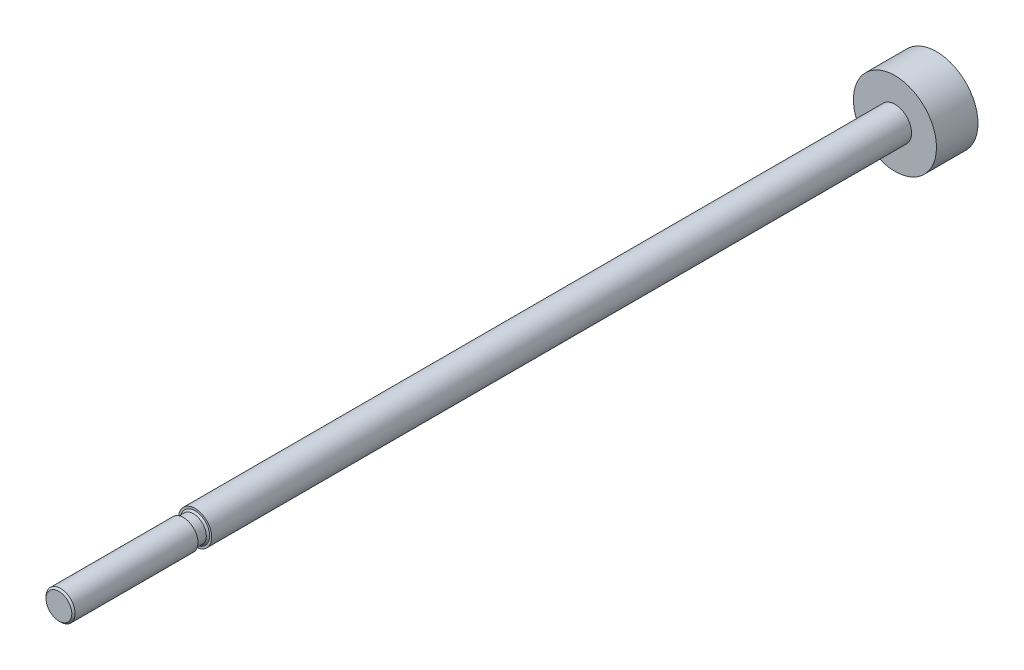
ISO-10303-21;
HEADER;
FILE_DESCRIPTION(('STEP AP214'),'2;1');
FILE_NAME('part.step','',(''),(''),'','','');
FILE_SCHEMA(('AUTOMOTIVE_DESIGN { 1 0 10303 214 1 1 1 1 }'));
ENDSEC;
DATA;
#1=APPLICATION_CONTEXT('core data for automotive mechanical design processes');
#2=APPLICATION_PROTOCOL_DEFINITION('international standard','automotive_design',2000,#1);
#3=PRODUCT_CONTEXT('',#1,'mechanical');
#4=PRODUCT('Part','Part','',(#3));
#5=PRODUCT_RELATED_PRODUCT_CATEGORY('part','',(#4));
#6=PRODUCT_DEFINITION_FORMATION('','',#4);
#7=PRODUCT_DEFINITION_CONTEXT('part definition',#1,'design');
#8=PRODUCT_DEFINITION('design','',#6,#7);
#9=PRODUCT_DEFINITION_SHAPE('','',#8);
#10=(LENGTH_UNIT() NAMED_UNIT(*) SI_UNIT(.MILLI.,.METRE.));
#11=(NAMED_UNIT(*) PLANE_ANGLE_UNIT() SI_UNIT($,.RADIAN.));
#12=(NAMED_UNIT(*) SI_UNIT($,.STERADIAN.) SOLID_ANGLE_UNIT());
#13=UNCERTAINTY_MEASURE_WITH_UNIT(LENGTH_MEASURE(1.E-05),#10,'distance_accuracy_value','');
#14=(GEOMETRIC_REPRESENTATION_CONTEXT(3) GLOBAL_UNCERTAINTY_ASSIGNED_CONTEXT((#13)) GLOBAL_UNIT_ASSIGNED_CONTEXT((#10,
#11,#12)) REPRESENTATION_CONTEXT('',''));
#15=CARTESIAN_POINT('',(0.,0.,0.));
#16=DIRECTION('',(0.,0.,1.));
#17=DIRECTION('',(1.,0.,0.));
#18=AXIS2_PLACEMENT_3D('',#15,#16,#17);
#19=CARTESIAN_POINT('',(0.,0.,2.5));
#20=DIRECTION('',(0.,0.,1.));
#21=DIRECTION('',(1.,0.,0.));
#22=AXIS2_PLACEMENT_3D('',#19,#20,#21);
#23=PLANE('',#22);
#24=CARTESIAN_POINT('',(0.,0.,2.5));
#25=DIRECTION('',(0.,0.,1.));
#26=DIRECTION('',(1.,0.,0.));
#27=AXIS2_PLACEMENT_3D('',#24,#25,#26);
#28=CIRCLE('',#27,5.);
#29=CARTESIAN_POINT('',(5.,0.,2.5));
#30=VERTEX_POINT('',#29);
#31=EDGE_CURVE('E48',#30,#30,#28,.T.);
#32=ORIENTED_EDGE('',*,*,#31,.T.);
#33=EDGE_LOOP('',(#32));
#34=FACE_BOUND('',#33,.T.);
#35=CARTESIAN_POINT('',(0.,0.,2.5));
#36=DIRECTION('',(0.,0.,1.));
#37=DIRECTION('',(1.,0.,0.));
#38=AXIS2_PLACEMENT_3D('',#35,#36,#37);
#39=CIRCLE('',#38,2.);
#40=CARTESIAN_POINT('',(2.,0.,2.5));
#41=VERTEX_POINT('',#40);
#42=EDGE_CURVE('E10',#41,#41,#39,.T.);
#43=ORIENTED_EDGE('',*,*,#42,.F.);
#44=EDGE_LOOP('',(#43));
#45=FACE_BOUND('',#44,.T.);
#46=ADVANCED_FACE('F39',(#34,#45),#23,.T.);
#47=CARTESIAN_POINT('',(0.,0.,2.5));
#48=DIRECTION('',(0.,0.,-1.));
#49=DIRECTION('',(-1.,0.,0.));
#50=AXIS2_PLACEMENT_3D('',#47,#48,#49);
#51=CYLINDRICAL_SURFACE('',#50,5.);
#52=ORIENTED_EDGE('',*,*,#31,.F.);
#53=EDGE_LOOP('',(#52));
#54=FACE_BOUND('',#53,.T.);
#55=CARTESIAN_POINT('',(0.,0.,-2.5));
#56=DIRECTION('',(0.,0.,1.));
#57=DIRECTION('',(1.,0.,0.));
#58=AXIS2_PLACEMENT_3D('',#55,#56,#57);
#59=CIRCLE('',#58,5.);
#60=CARTESIAN_POINT('',(5.,0.,-2.5));
#61=VERTEX_POINT('',#60);
#62=EDGE_CURVE('E53',#61,#61,#59,.T.);
#63=ORIENTED_EDGE('',*,*,#62,.T.);
#64=EDGE_LOOP('',(#63));
#65=FACE_BOUND('',#64,.T.);
#66=ADVANCED_FACE('F124',(#54,#65),#51,.T.);
#67=CARTESIAN_POINT('',(0.,0.,-2.5));
#68=DIRECTION('',(0.,0.,1.));
#69=DIRECTION('',(1.,0.,0.));
#70=AXIS2_PLACEMENT_3D('',#67,#68,#69);
#71=PLANE('',#70);
#72=ORIENTED_EDGE('',*,*,#62,.F.);
#73=EDGE_LOOP('',(#72));
#74=FACE_BOUND('',#73,.T.);
#75=ADVANCED_FACE('F128',(#74),#71,.F.);
#76=CARTESIAN_POINT('',(0.,0.,108.841854249492));
#77=DIRECTION('',(0.,0.,-1.));
#78=DIRECTION('',(-1.,0.,0.));
#79=AXIS2_PLACEMENT_3D('',#76,#77,#78);
#80=CYLINDRICAL_SURFACE('',#79,2.);
#81=CARTESIAN_POINT('',(0.,0.,86.785));
#82=DIRECTION('',(0.,0.,-1.));
#83=DIRECTION('',(-1.,0.,0.));
#84=AXIS2_PLACEMENT_3D('',#81,#82,#83);
#85=CIRCLE('',#84,2.);
#86=CARTESIAN_POINT('',(-2.,0.,86.785));
#87=VERTEX_POINT('',#86);
#88=EDGE_CURVE('E43',#87,#87,#85,.T.);
#89=ORIENTED_EDGE('',*,*,#88,.T.);
#90=EDGE_LOOP('',(#89));
#91=FACE_BOUND('',#90,.T.);
#92=ORIENTED_EDGE('',*,*,#42,.T.);
#93=EDGE_LOOP('',(#92));
#94=FACE_BOUND('',#93,.T.);
#95=ADVANCED_FACE('F41',(#91,#94),#80,.T.);
#96=CARTESIAN_POINT('',(0.,1.74999999999999,86.785));
#97=DIRECTION('',(0.,0.,-1.));
#98=DIRECTION('',(-1.,0.,0.));
#99=AXIS2_PLACEMENT_3D('',#96,#97,#98);
#100=PLANE('',#99);
#101=CARTESIAN_POINT('',(0.,0.,86.785));
#102=DIRECTION('',(0.,0.,-1.));
#103=DIRECTION('',(-1.,0.,0.));
#104=AXIS2_PLACEMENT_3D('',#101,#102,#103);
#105=CIRCLE('',#104,1.74999999999999);
#106=CARTESIAN_POINT('',(-1.74999999999999,0.,86.785));
#107=VERTEX_POINT('',#106);
#108=EDGE_CURVE('E78',#107,#107,#105,.T.);
#109=ORIENTED_EDGE('',*,*,#108,.T.);
#110=EDGE_LOOP('',(#109));
#111=FACE_BOUND('',#110,.T.);
#112=ORIENTED_EDGE('',*,*,#88,.F.);
#113=EDGE_LOOP('',(#112));
#114=FACE_BOUND('',#113,.T.);
#115=ADVANCED_FACE('F82',(#111,#114),#100,.F.);
#116=CARTESIAN_POINT('',(0.,0.,103.185));
#117=DIRECTION('',(0.,0.,-1.));
#118=DIRECTION('',(-1.,0.,0.));
#119=AXIS2_PLACEMENT_3D('',#116,#117,#118);
#120=CONICAL_SURFACE('',#119,1.55249999999999,0.785398163397439);
#121=CARTESIAN_POINT('',(0.,0.,102.985));
#122=DIRECTION('',(0.,0.,-1.));
#123=DIRECTION('',(-1.,0.,0.));
#124=AXIS2_PLACEMENT_3D('',#121,#122,#123);
#125=CIRCLE('',#124,1.75249999999999);
#126=CARTESIAN_POINT('',(-1.75249999999999,0.,102.985));
#127=VERTEX_POINT('',#126);
#128=EDGE_CURVE('E62',#127,#127,#125,.T.);
#129=ORIENTED_EDGE('',*,*,#128,.F.);
#130=EDGE_LOOP('',(#129));
#131=FACE_BOUND('',#130,.T.);
#132=CARTESIAN_POINT('',(0.,0.,103.185));
#133=DIRECTION('',(0.,0.,-1.));
#134=DIRECTION('',(-1.,0.,0.));
#135=AXIS2_PLACEMENT_3D('',#132,#133,#134);
#136=CIRCLE('',#135,1.55249999999999);
#137=CARTESIAN_POINT('',(-1.55249999999999,0.,103.185));
#138=VERTEX_POINT('',#137);
#139=EDGE_CURVE('E58',#138,#138,#136,.T.);
#140=ORIENTED_EDGE('',*,*,#139,.T.);
#141=EDGE_LOOP('',(#140));
#142=FACE_BOUND('',#141,.T.);
#143=ADVANCED_FACE('F109',(#131,#142),#120,.T.);
#144=CARTESIAN_POINT('',(0.,0.,0.));
#145=DIRECTION('',(0.,0.,-1.));
#146=DIRECTION('',(-1.,0.,0.));
#147=AXIS2_PLACEMENT_3D('',#144,#145,#146);
#148=CYLINDRICAL_SURFACE('',#147,1.75249999999999);
#149=CARTESIAN_POINT('',(0.,0.,88.185));
#150=DIRECTION('',(0.,0.,-1.));
#151=DIRECTION('',(-1.,0.,0.));
#152=AXIS2_PLACEMENT_3D('',#149,#150,#151);
#153=CIRCLE('',#152,1.75249999999999);
#154=CARTESIAN_POINT('',(-1.75249999999999,0.,88.185));
#155=VERTEX_POINT('',#154);
#156=EDGE_CURVE('E70',#155,#155,#153,.T.);
#157=ORIENTED_EDGE('',*,*,#156,.F.);
#158=EDGE_LOOP('',(#157));
#159=FACE_BOUND('',#158,.T.);
#160=ORIENTED_EDGE('',*,*,#128,.T.);
#161=EDGE_LOOP('',(#160));
#162=FACE_BOUND('',#161,.T.);
#163=ADVANCED_FACE('F102',(#159,#162),#148,.T.);
#164=CARTESIAN_POINT('',(0.,1.75249999999999,88.185));
#165=DIRECTION('',(0.,0.,1.));
#166=DIRECTION('',(1.,0.,0.));
#167=AXIS2_PLACEMENT_3D('',#164,#165,#166);
#168=PLANE('',#167);
#169=CARTESIAN_POINT('',(0.,0.,88.185));
#170=DIRECTION('',(0.,0.,-1.));
#171=DIRECTION('',(-1.,0.,0.));
#172=AXIS2_PLACEMENT_3D('',#169,#170,#171);
#173=CIRCLE('',#172,1.54999999999999);
#174=CARTESIAN_POINT('',(-1.54999999999999,0.,88.185));
#175=VERTEX_POINT('',#174);
#176=EDGE_CURVE('E72',#175,#175,#173,.T.);
#177=ORIENTED_EDGE('',*,*,#176,.F.);
#178=EDGE_LOOP('',(#177));
#179=FACE_BOUND('',#178,.T.);
#180=ORIENTED_EDGE('',*,*,#156,.T.);
#181=EDGE_LOOP('',(#180));
#182=FACE_BOUND('',#181,.T.);
#183=ADVANCED_FACE('F98',(#179,#182),#168,.F.);
#184=CARTESIAN_POINT('',(0.,0.,0.));
#185=DIRECTION('',(0.,0.,-1.));
#186=DIRECTION('',(-1.,0.,0.));
#187=AXIS2_PLACEMENT_3D('',#184,#185,#186);
#188=CYLINDRICAL_SURFACE('',#187,1.54999999999999);
#189=CARTESIAN_POINT('',(0.,0.,86.985));
#190=DIRECTION('',(0.,0.,-1.));
#191=DIRECTION('',(-1.,0.,0.));
#192=AXIS2_PLACEMENT_3D('',#189,#190,#191);
#193=CIRCLE('',#192,1.54999999999999);
#194=CARTESIAN_POINT('',(-1.54999999999999,0.,86.985));
#195=VERTEX_POINT('',#194);
#196=EDGE_CURVE('E73',#195,#195,#193,.T.);
#197=ORIENTED_EDGE('',*,*,#196,.F.);
#198=EDGE_LOOP('',(#197));
#199=FACE_BOUND('',#198,.T.);
#200=ORIENTED_EDGE('',*,*,#176,.T.);
#201=EDGE_LOOP('',(#200));
#202=FACE_BOUND('',#201,.T.);
#203=ADVANCED_FACE('F95',(#199,#202),#188,.T.);
#204=CARTESIAN_POINT('',(0.,0.,86.985));
#205=DIRECTION('',(0.,0.,-1.));
#206=DIRECTION('',(-1.,0.,0.));
#207=AXIS2_PLACEMENT_3D('',#204,#205,#206);
#208=CONICAL_SURFACE('',#207,1.54999999999999,0.785398163397435);
#209=ORIENTED_EDGE('',*,*,#108,.F.);
#210=EDGE_LOOP('',(#209));
#211=FACE_BOUND('',#210,.T.);
#212=ORIENTED_EDGE('',*,*,#196,.T.);
#213=EDGE_LOOP('',(#212));
#214=FACE_BOUND('',#213,.T.);
#215=ADVANCED_FACE('F86',(#211,#214),#208,.T.);
#216=CARTESIAN_POINT('',(0.,0.,103.185));
#217=DIRECTION('',(0.,0.,-1.));
#218=DIRECTION('',(-1.,0.,0.));
#219=AXIS2_PLACEMENT_3D('',#216,#217,#218);
#220=PLANE('',#219);
#221=ORIENTED_EDGE('',*,*,#139,.F.);
#222=EDGE_LOOP('',(#221));
#223=FACE_BOUND('',#222,.T.);
#224=ADVANCED_FACE('F93',(#223),#220,.F.);
#225=CLOSED_SHELL('',(#46,#66,#75,#95,#115,#143,#163,#183,#203,#215,#224));
#226=MANIFOLD_SOLID_BREP('B2',#225);
#227=ADVANCED_BREP_SHAPE_REPRESENTATION('',(#18,#226),#14);
#228=SHAPE_DEFINITION_REPRESENTATION(#9,#227);
ENDSEC;
END-ISO-10303-21;
